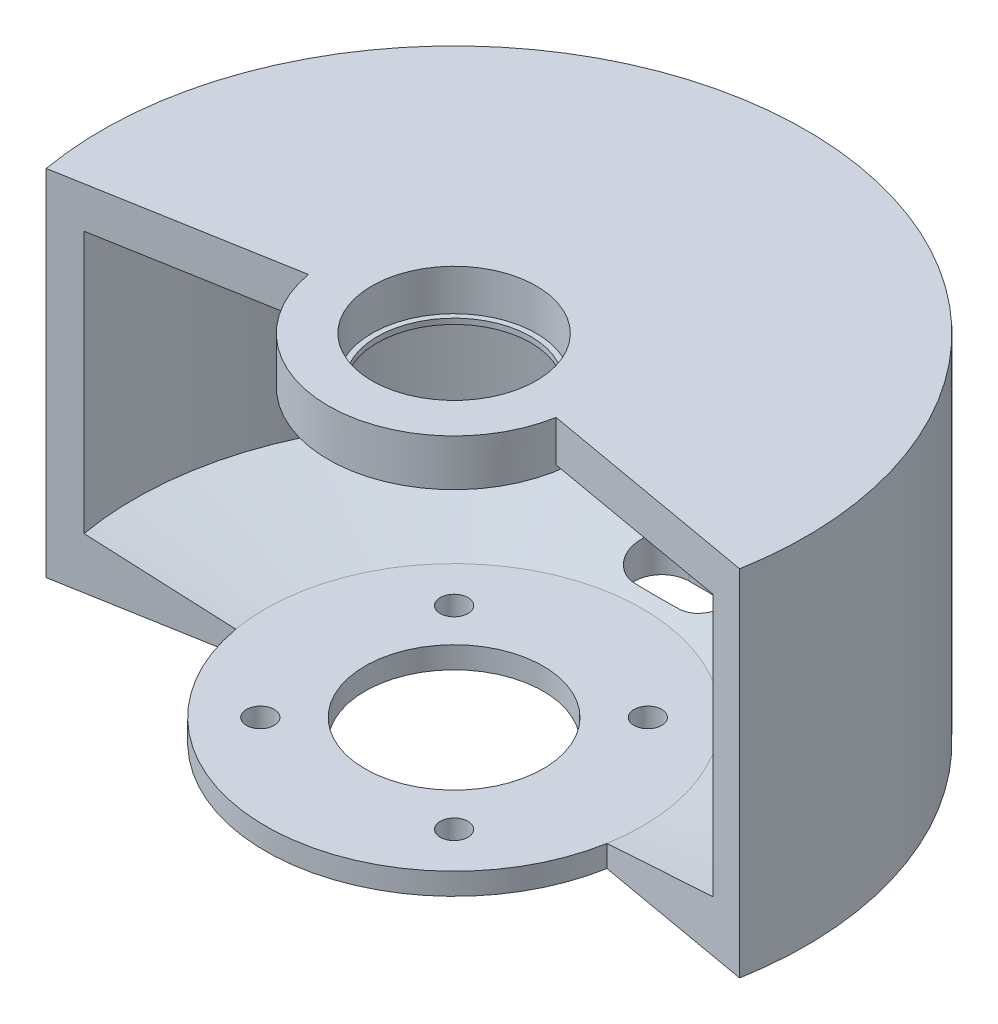
ISO-10303-21;
HEADER;
FILE_DESCRIPTION(('STEP AP214'),'2;1');
FILE_NAME('part.step','',(''),(''),'','','');
FILE_SCHEMA(('AUTOMOTIVE_DESIGN { 1 0 10303 214 1 1 1 1 }'));
ENDSEC;
DATA;
#1=APPLICATION_CONTEXT('core data for automotive mechanical design processes');
#2=APPLICATION_PROTOCOL_DEFINITION('international standard','automotive_design',2000,#1);
#3=PRODUCT_CONTEXT('',#1,'mechanical');
#4=PRODUCT('Part','Part','',(#3));
#5=PRODUCT_RELATED_PRODUCT_CATEGORY('part','',(#4));
#6=PRODUCT_DEFINITION_FORMATION('','',#4);
#7=PRODUCT_DEFINITION_CONTEXT('part definition',#1,'design');
#8=PRODUCT_DEFINITION('design','',#6,#7);
#9=PRODUCT_DEFINITION_SHAPE('','',#8);
#10=(LENGTH_UNIT() NAMED_UNIT(*) SI_UNIT(.MILLI.,.METRE.));
#11=(NAMED_UNIT(*) PLANE_ANGLE_UNIT() SI_UNIT($,.RADIAN.));
#12=(NAMED_UNIT(*) SI_UNIT($,.STERADIAN.) SOLID_ANGLE_UNIT());
#13=UNCERTAINTY_MEASURE_WITH_UNIT(LENGTH_MEASURE(1.E-05),#10,'distance_accuracy_value','');
#14=(GEOMETRIC_REPRESENTATION_CONTEXT(3) GLOBAL_UNCERTAINTY_ASSIGNED_CONTEXT((#13)) GLOBAL_UNIT_ASSIGNED_CONTEXT((#10,
#11,#12)) REPRESENTATION_CONTEXT('',''));
#15=CARTESIAN_POINT('',(0.,0.,0.));
#16=DIRECTION('',(0.,0.,1.));
#17=DIRECTION('',(1.,0.,0.));
#18=AXIS2_PLACEMENT_3D('',#15,#16,#17);
#19=CARTESIAN_POINT('',(0.,-17.3,0.));
#20=DIRECTION('',(0.,1.,0.));
#21=DIRECTION('',(0.,0.,1.));
#22=AXIS2_PLACEMENT_3D('',#19,#20,#21);
#23=CYLINDRICAL_SURFACE('',#22,27.5);
#24=CARTESIAN_POINT('',(0.,-14.125,0.));
#25=DIRECTION('',(0.,1.,0.));
#26=DIRECTION('',(0.,0.,1.));
#27=AXIS2_PLACEMENT_3D('',#24,#25,#26);
#28=CIRCLE('',#27,27.5);
#29=CARTESIAN_POINT('',(-27.0822132078357,-14.125,4.77532488584069));
#30=VERTEX_POINT('',#29);
#31=CARTESIAN_POINT('',(27.0822132078357,-14.125,4.77532488584069));
#32=VERTEX_POINT('',#31);
#33=EDGE_CURVE('E274',#30,#32,#28,.T.);
#34=ORIENTED_EDGE('',*,*,#33,.F.);
#35=DIRECTION('',(0.,-1.,0.));
#36=VECTOR('',#35,1.);
#37=CARTESIAN_POINT('',(-27.0822132078357,-17.3,4.77532488584068));
#38=LINE('',#37,#36);
#39=CARTESIAN_POINT('',(-27.0822132078357,-17.3,4.77532488584068));
#40=VERTEX_POINT('',#39);
#41=EDGE_CURVE('E277',#30,#40,#38,.T.);
#42=ORIENTED_EDGE('',*,*,#41,.T.);
#43=CARTESIAN_POINT('',(0.,-17.3,0.));
#44=DIRECTION('',(0.,1.,0.));
#45=DIRECTION('',(0.,0.,1.));
#46=AXIS2_PLACEMENT_3D('',#43,#44,#45);
#47=CIRCLE('',#46,27.5);
#48=CARTESIAN_POINT('',(27.0822132078357,-17.3,4.77532488584069));
#49=VERTEX_POINT('',#48);
#50=EDGE_CURVE('E11',#40,#49,#47,.T.);
#51=ORIENTED_EDGE('',*,*,#50,.T.);
#52=DIRECTION('',(0.,-1.,0.));
#53=VECTOR('',#52,1.);
#54=CARTESIAN_POINT('',(27.0822132078357,-17.3,4.77532488584069));
#55=LINE('',#54,#53);
#56=EDGE_CURVE('E279',#32,#49,#55,.T.);
#57=ORIENTED_EDGE('',*,*,#56,.F.);
#58=EDGE_LOOP('',(#34,#42,#51,#57));
#59=FACE_BOUND('',#58,.T.);
#60=ADVANCED_FACE('F37',(#59),#23,.T.);
#61=CARTESIAN_POINT('',(0.,-17.3,0.));
#62=DIRECTION('',(0.,1.,0.));
#63=DIRECTION('',(0.,0.,1.));
#64=AXIS2_PLACEMENT_3D('',#61,#62,#63);
#65=PLANE('',#64);
#66=CARTESIAN_POINT('',(3.25,-17.3,-33.5800000000001));
#67=DIRECTION('',(0.,-1.,0.));
#68=DIRECTION('',(0.,0.,-1.));
#69=AXIS2_PLACEMENT_3D('',#66,#67,#68);
#70=CIRCLE('',#69,3.96875);
#71=CARTESIAN_POINT('',(3.25,-17.3,-37.5487500000001));
#72=VERTEX_POINT('',#71);
#73=CARTESIAN_POINT('',(3.25,-17.3,-29.6112500000001));
#74=VERTEX_POINT('',#73);
#75=EDGE_CURVE('E140',#72,#74,#70,.T.);
#76=ORIENTED_EDGE('',*,*,#75,.F.);
#77=DIRECTION('',(1.,0.,0.));
#78=VECTOR('',#77,1.);
#79=CARTESIAN_POINT('',(-3.25,-17.3,-37.5487500000001));
#80=LINE('',#79,#78);
#81=CARTESIAN_POINT('',(-3.25,-17.3,-37.5487500000001));
#82=VERTEX_POINT('',#81);
#83=EDGE_CURVE('E415',#82,#72,#80,.T.);
#84=ORIENTED_EDGE('',*,*,#83,.F.);
#85=CARTESIAN_POINT('',(-3.25,-17.3,-33.5800000000001));
#86=DIRECTION('',(0.,-1.,0.));
#87=DIRECTION('',(0.,0.,-1.));
#88=AXIS2_PLACEMENT_3D('',#85,#86,#87);
#89=CIRCLE('',#88,3.96875000000001);
#90=CARTESIAN_POINT('',(-3.25,-17.3,-29.61125));
#91=VERTEX_POINT('',#90);
#92=EDGE_CURVE('E180',#91,#82,#89,.T.);
#93=ORIENTED_EDGE('',*,*,#92,.F.);
#94=DIRECTION('',(-1.,0.,0.));
#95=VECTOR('',#94,1.);
#96=CARTESIAN_POINT('',(-3.25,-17.3,-29.6112500000001));
#97=LINE('',#96,#95);
#98=EDGE_CURVE('E51',#74,#91,#97,.T.);
#99=ORIENTED_EDGE('',*,*,#98,.F.);
#100=EDGE_LOOP('',(#76,#84,#93,#99));
#101=FACE_BOUND('',#100,.T.);
#102=CARTESIAN_POINT('',(-14.1421356237311,-17.3,-14.1421356237308));
#103=DIRECTION('',(0.,1.,0.));
#104=DIRECTION('',(0.,0.,1.));
#105=AXIS2_PLACEMENT_3D('',#102,#103,#104);
#106=CIRCLE('',#105,2.025);
#107=CARTESIAN_POINT('',(-14.1421356237311,-17.3,-12.1171356237308));
#108=VERTEX_POINT('',#107);
#109=EDGE_CURVE('E328',#108,#108,#106,.T.);
#110=ORIENTED_EDGE('',*,*,#109,.T.);
#111=EDGE_LOOP('',(#110));
#112=FACE_BOUND('',#111,.T.);
#113=CARTESIAN_POINT('',(14.1421356237309,-17.3,-14.142135623731));
#114=DIRECTION('',(0.,1.,0.));
#115=DIRECTION('',(0.,0.,1.));
#116=AXIS2_PLACEMENT_3D('',#113,#114,#115);
#117=CIRCLE('',#116,2.025);
#118=CARTESIAN_POINT('',(14.1421356237309,-17.3,-12.117135623731));
#119=VERTEX_POINT('',#118);
#120=EDGE_CURVE('E334',#119,#119,#117,.T.);
#121=ORIENTED_EDGE('',*,*,#120,.T.);
#122=EDGE_LOOP('',(#121));
#123=FACE_BOUND('',#122,.T.);
#124=CARTESIAN_POINT('',(14.142135623731,-17.3,14.1421356237309));
#125=DIRECTION('',(0.,1.,0.));
#126=DIRECTION('',(0.,0.,1.));
#127=AXIS2_PLACEMENT_3D('',#124,#125,#126);
#128=CIRCLE('',#127,2.025);
#129=CARTESIAN_POINT('',(14.142135623731,-17.3,16.1671356237309));
#130=VERTEX_POINT('',#129);
#131=EDGE_CURVE('E340',#130,#130,#128,.T.);
#132=ORIENTED_EDGE('',*,*,#131,.T.);
#133=EDGE_LOOP('',(#132));
#134=FACE_BOUND('',#133,.T.);
#135=CARTESIAN_POINT('',(-14.142135623731,-17.3,14.142135623731));
#136=DIRECTION('',(0.,1.,0.));
#137=DIRECTION('',(0.,0.,1.));
#138=AXIS2_PLACEMENT_3D('',#135,#136,#137);
#139=CIRCLE('',#138,2.025);
#140=CARTESIAN_POINT('',(-14.142135623731,-17.3,16.167135623731));
#141=VERTEX_POINT('',#140);
#142=EDGE_CURVE('E346',#141,#141,#139,.T.);
#143=ORIENTED_EDGE('',*,*,#142,.T.);
#144=EDGE_LOOP('',(#143));
#145=FACE_BOUND('',#144,.T.);
#146=CARTESIAN_POINT('',(0.,-17.3,0.));
#147=DIRECTION('',(0.,1.,0.));
#148=DIRECTION('',(0.,0.,1.));
#149=AXIS2_PLACEMENT_3D('',#146,#147,#148);
#150=CIRCLE('',#149,13.000000035);
#151=CARTESIAN_POINT('',(0.,-17.3,13.000000035));
#152=VERTEX_POINT('',#151);
#153=EDGE_CURVE('E281',#152,#152,#150,.T.);
#154=ORIENTED_EDGE('',*,*,#153,.T.);
#155=EDGE_LOOP('',(#154));
#156=FACE_BOUND('',#155,.T.);
#157=ORIENTED_EDGE('',*,*,#50,.F.);
#158=DIRECTION('',(-0.984807753012207,0.,0.173648177666934));
#159=VECTOR('',#158,1.);
#160=CARTESIAN_POINT('',(-27.0822132078357,-17.3,4.77532488584068));
#161=LINE('',#160,#159);
#162=CARTESIAN_POINT('',(-50.6055773982236,-17.3,8.92312866963749));
#163=VERTEX_POINT('',#162);
#164=EDGE_CURVE('E294',#40,#163,#161,.T.);
#165=ORIENTED_EDGE('',*,*,#164,.T.);
#166=CARTESIAN_POINT('',(0.,-17.3,0.));
#167=DIRECTION('',(0.,-1.,0.));
#168=DIRECTION('',(0.,0.,-1.));
#169=AXIS2_PLACEMENT_3D('',#166,#167,#168);
#170=CIRCLE('',#169,51.38625);
#171=CARTESIAN_POINT('',(50.6055773982236,-17.3,8.92312866963749));
#172=VERTEX_POINT('',#171);
#173=EDGE_CURVE('E325',#163,#172,#170,.T.);
#174=ORIENTED_EDGE('',*,*,#173,.T.);
#175=DIRECTION('',(0.984807753012207,0.,0.173648177666934));
#176=VECTOR('',#175,1.);
#177=CARTESIAN_POINT('',(27.0822132078357,-17.3,4.77532488584069));
#178=LINE('',#177,#176);
#179=EDGE_CURVE('E362',#49,#172,#178,.T.);
#180=ORIENTED_EDGE('',*,*,#179,.F.);
#181=EDGE_LOOP('',(#157,#165,#174,#180));
#182=FACE_BOUND('',#181,.T.);
#183=ADVANCED_FACE('F255',(#101,#112,#123,#134,#145,#156,#182),#65,.F.);
#184=CARTESIAN_POINT('',(0.,-14.125,0.));
#185=DIRECTION('',(0.,1.,0.));
#186=DIRECTION('',(0.,0.,1.));
#187=AXIS2_PLACEMENT_3D('',#184,#185,#186);
#188=PLANE('',#187);
#189=CARTESIAN_POINT('',(-14.1421356237311,-14.125,-14.1421356237308));
#190=DIRECTION('',(0.,1.,0.));
#191=DIRECTION('',(0.,0.,1.));
#192=AXIS2_PLACEMENT_3D('',#189,#190,#191);
#193=CIRCLE('',#192,2.025);
#194=CARTESIAN_POINT('',(-14.1421356237311,-14.125,-12.1171356237308));
#195=VERTEX_POINT('',#194);
#196=EDGE_CURVE('E327',#195,#195,#193,.T.);
#197=ORIENTED_EDGE('',*,*,#196,.F.);
#198=EDGE_LOOP('',(#197));
#199=FACE_BOUND('',#198,.T.);
#200=CARTESIAN_POINT('',(14.1421356237309,-14.125,-14.142135623731));
#201=DIRECTION('',(0.,1.,0.));
#202=DIRECTION('',(0.,0.,1.));
#203=AXIS2_PLACEMENT_3D('',#200,#201,#202);
#204=CIRCLE('',#203,2.025);
#205=CARTESIAN_POINT('',(14.1421356237309,-14.125,-12.117135623731));
#206=VERTEX_POINT('',#205);
#207=EDGE_CURVE('E331',#206,#206,#204,.T.);
#208=ORIENTED_EDGE('',*,*,#207,.F.);
#209=EDGE_LOOP('',(#208));
#210=FACE_BOUND('',#209,.T.);
#211=CARTESIAN_POINT('',(14.142135623731,-14.125,14.1421356237309));
#212=DIRECTION('',(0.,1.,0.));
#213=DIRECTION('',(0.,0.,1.));
#214=AXIS2_PLACEMENT_3D('',#211,#212,#213);
#215=CIRCLE('',#214,2.025);
#216=CARTESIAN_POINT('',(14.142135623731,-14.125,16.1671356237309));
#217=VERTEX_POINT('',#216);
#218=EDGE_CURVE('E337',#217,#217,#215,.T.);
#219=ORIENTED_EDGE('',*,*,#218,.F.);
#220=EDGE_LOOP('',(#219));
#221=FACE_BOUND('',#220,.T.);
#222=CARTESIAN_POINT('',(-14.142135623731,-14.125,14.142135623731));
#223=DIRECTION('',(0.,1.,0.));
#224=DIRECTION('',(0.,0.,1.));
#225=AXIS2_PLACEMENT_3D('',#222,#223,#224);
#226=CIRCLE('',#225,2.025);
#227=CARTESIAN_POINT('',(-14.142135623731,-14.125,16.167135623731));
#228=VERTEX_POINT('',#227);
#229=EDGE_CURVE('E343',#228,#228,#226,.T.);
#230=ORIENTED_EDGE('',*,*,#229,.F.);
#231=EDGE_LOOP('',(#230));
#232=FACE_BOUND('',#231,.T.);
#233=CARTESIAN_POINT('',(0.,-14.125,0.));
#234=DIRECTION('',(0.,1.,0.));
#235=DIRECTION('',(0.,0.,1.));
#236=AXIS2_PLACEMENT_3D('',#233,#234,#235);
#237=CIRCLE('',#236,13.000000035);
#238=CARTESIAN_POINT('',(0.,-14.125,13.000000035));
#239=VERTEX_POINT('',#238);
#240=EDGE_CURVE('E349',#239,#239,#237,.T.);
#241=ORIENTED_EDGE('',*,*,#240,.F.);
#242=EDGE_LOOP('',(#241));
#243=FACE_BOUND('',#242,.T.);
#244=EDGE_CURVE('E40',#32,#30,#28,.T.);
#245=ORIENTED_EDGE('',*,*,#244,.T.);
#246=ORIENTED_EDGE('',*,*,#33,.T.);
#247=EDGE_LOOP('',(#245,#246));
#248=FACE_BOUND('',#247,.T.);
#249=ADVANCED_FACE('F253',(#199,#210,#221,#232,#243,#248),#188,.T.);
#250=CARTESIAN_POINT('',(0.,-17.3,0.));
#251=DIRECTION('',(0.,1.,0.));
#252=DIRECTION('',(0.,0.,1.));
#253=AXIS2_PLACEMENT_3D('',#250,#251,#252);
#254=CYLINDRICAL_SURFACE('',#253,13.000000035);
#255=ORIENTED_EDGE('',*,*,#153,.F.);
#256=EDGE_LOOP('',(#255));
#257=FACE_BOUND('',#256,.T.);
#258=ORIENTED_EDGE('',*,*,#240,.T.);
#259=EDGE_LOOP('',(#258));
#260=FACE_BOUND('',#259,.T.);
#261=ADVANCED_FACE('F249',(#257,#260),#254,.F.);
#262=CARTESIAN_POINT('',(-14.142135623731,-17.3,14.142135623731));
#263=DIRECTION('',(0.,1.,0.));
#264=DIRECTION('',(0.,0.,1.));
#265=AXIS2_PLACEMENT_3D('',#262,#263,#264);
#266=CYLINDRICAL_SURFACE('',#265,2.025);
#267=ORIENTED_EDGE('',*,*,#142,.F.);
#268=EDGE_LOOP('',(#267));
#269=FACE_BOUND('',#268,.T.);
#270=ORIENTED_EDGE('',*,*,#229,.T.);
#271=EDGE_LOOP('',(#270));
#272=FACE_BOUND('',#271,.T.);
#273=ADVANCED_FACE('F245',(#269,#272),#266,.F.);
#274=CARTESIAN_POINT('',(14.142135623731,-17.3,14.1421356237309));
#275=DIRECTION('',(0.,1.,0.));
#276=DIRECTION('',(0.,0.,1.));
#277=AXIS2_PLACEMENT_3D('',#274,#275,#276);
#278=CYLINDRICAL_SURFACE('',#277,2.025);
#279=ORIENTED_EDGE('',*,*,#131,.F.);
#280=EDGE_LOOP('',(#279));
#281=FACE_BOUND('',#280,.T.);
#282=ORIENTED_EDGE('',*,*,#218,.T.);
#283=EDGE_LOOP('',(#282));
#284=FACE_BOUND('',#283,.T.);
#285=ADVANCED_FACE('F241',(#281,#284),#278,.F.);
#286=CARTESIAN_POINT('',(14.1421356237309,-17.3,-14.142135623731));
#287=DIRECTION('',(0.,1.,0.));
#288=DIRECTION('',(0.,0.,1.));
#289=AXIS2_PLACEMENT_3D('',#286,#287,#288);
#290=CYLINDRICAL_SURFACE('',#289,2.025);
#291=ORIENTED_EDGE('',*,*,#120,.F.);
#292=EDGE_LOOP('',(#291));
#293=FACE_BOUND('',#292,.T.);
#294=ORIENTED_EDGE('',*,*,#207,.T.);
#295=EDGE_LOOP('',(#294));
#296=FACE_BOUND('',#295,.T.);
#297=ADVANCED_FACE('F237',(#293,#296),#290,.F.);
#298=CARTESIAN_POINT('',(-14.1421356237311,-17.3,-14.1421356237308));
#299=DIRECTION('',(0.,1.,0.));
#300=DIRECTION('',(0.,0.,1.));
#301=AXIS2_PLACEMENT_3D('',#298,#299,#300);
#302=CYLINDRICAL_SURFACE('',#301,2.025);
#303=ORIENTED_EDGE('',*,*,#109,.F.);
#304=EDGE_LOOP('',(#303));
#305=FACE_BOUND('',#304,.T.);
#306=ORIENTED_EDGE('',*,*,#196,.T.);
#307=EDGE_LOOP('',(#306));
#308=FACE_BOUND('',#307,.T.);
#309=ADVANCED_FACE('F233',(#305,#308),#302,.F.);
#310=CARTESIAN_POINT('',(0.,-14.125,0.));
#311=DIRECTION('',(0.,-1.,0.));
#312=DIRECTION('',(0.,0.,-1.));
#313=AXIS2_PLACEMENT_3D('',#310,#311,#312);
#314=CYLINDRICAL_SURFACE('',#313,51.38625);
#315=CARTESIAN_POINT('',(0.,34.42749997,0.));
#316=DIRECTION('',(0.,-1.,0.));
#317=DIRECTION('',(0.,0.,-1.));
#318=AXIS2_PLACEMENT_3D('',#315,#316,#317);
#319=CIRCLE('',#318,51.38625);
#320=CARTESIAN_POINT('',(-50.6055773982236,34.42749997,8.9231286696375));
#321=VERTEX_POINT('',#320);
#322=CARTESIAN_POINT('',(50.6055773982236,34.42749997,8.9231286696375));
#323=VERTEX_POINT('',#322);
#324=EDGE_CURVE('E323',#321,#323,#319,.T.);
#325=ORIENTED_EDGE('',*,*,#324,.T.);
#326=DIRECTION('',(0.,1.,0.));
#327=VECTOR('',#326,1.);
#328=CARTESIAN_POINT('',(50.6055773982236,-17.3,8.92312866963749));
#329=LINE('',#328,#327);
#330=EDGE_CURVE('E365',#172,#323,#329,.T.);
#331=ORIENTED_EDGE('',*,*,#330,.F.);
#332=ORIENTED_EDGE('',*,*,#173,.F.);
#333=DIRECTION('',(0.,1.,0.));
#334=VECTOR('',#333,1.);
#335=CARTESIAN_POINT('',(-50.6055773982236,-17.3,8.92312866963749));
#336=LINE('',#335,#334);
#337=EDGE_CURVE('E302',#163,#321,#336,.T.);
#338=ORIENTED_EDGE('',*,*,#337,.T.);
#339=EDGE_LOOP('',(#325,#331,#332,#338));
#340=FACE_BOUND('',#339,.T.);
#341=ADVANCED_FACE('F229',(#340),#314,.T.);
#342=CARTESIAN_POINT('',(-50.6055773982236,34.42749997,8.9231286696375));
#343=DIRECTION('',(0.,1.,0.));
#344=DIRECTION('',(0.,0.,1.));
#345=AXIS2_PLACEMENT_3D('',#342,#343,#344);
#346=PLANE('',#345);
#347=DIRECTION('',(0.984807753012208,0.,-0.173648177666934));
#348=VECTOR('',#347,1.);
#349=CARTESIAN_POINT('',(-50.6055773982236,34.42749997,8.9231286696375));
#350=LINE('',#349,#348);
#351=CARTESIAN_POINT('',(-18.071222267774,34.42749997,3.18644406018824));
#352=VERTEX_POINT('',#351);
#353=EDGE_CURVE('E305',#321,#352,#350,.T.);
#354=ORIENTED_EDGE('',*,*,#353,.T.);
#355=CARTESIAN_POINT('',(0.,34.42749997,0.));
#356=DIRECTION('',(0.,1.,0.));
#357=DIRECTION('',(0.,0.,1.));
#358=AXIS2_PLACEMENT_3D('',#355,#356,#357);
#359=CIRCLE('',#358,18.35);
#360=CARTESIAN_POINT('',(18.071222267774,34.42749997,3.18644406018824));
#361=VERTEX_POINT('',#360);
#362=EDGE_CURVE('E369',#352,#361,#359,.T.);
#363=ORIENTED_EDGE('',*,*,#362,.T.);
#364=DIRECTION('',(-0.984807753012207,0.,-0.173648177666934));
#365=VECTOR('',#364,1.);
#366=CARTESIAN_POINT('',(50.6055773982236,34.42749997,8.9231286696375));
#367=LINE('',#366,#365);
#368=EDGE_CURVE('E367',#323,#361,#367,.T.);
#369=ORIENTED_EDGE('',*,*,#368,.F.);
#370=ORIENTED_EDGE('',*,*,#324,.F.);
#371=EDGE_LOOP('',(#354,#363,#369,#370));
#372=FACE_BOUND('',#371,.T.);
#373=CARTESIAN_POINT('',(0.,34.42749997,0.));
#374=DIRECTION('',(0.,1.,0.));
#375=DIRECTION('',(0.,0.,1.));
#376=AXIS2_PLACEMENT_3D('',#373,#374,#375);
#377=CIRCLE('',#376,12.);
#378=CARTESIAN_POINT('',(0.,34.42749997,12.));
#379=VERTEX_POINT('',#378);
#380=EDGE_CURVE('E385',#379,#379,#377,.T.);
#381=ORIENTED_EDGE('',*,*,#380,.F.);
#382=EDGE_LOOP('',(#381));
#383=FACE_BOUND('',#382,.T.);
#384=ADVANCED_FACE('F225',(#372,#383),#346,.T.);
#385=CARTESIAN_POINT('',(-45.9154304745029,28.427500017,8.09612922349872));
#386=DIRECTION('',(0.,-1.,0.));
#387=DIRECTION('',(0.,0.,-1.));
#388=AXIS2_PLACEMENT_3D('',#385,#386,#387);
#389=PLANE('',#388);
#390=DIRECTION('',(0.984807753012207,0.,0.173648177666934));
#391=VECTOR('',#390,1.);
#392=CARTESIAN_POINT('',(45.9154304745029,28.427500017,8.09612922349872));
#393=LINE('',#392,#391);
#394=CARTESIAN_POINT('',(18.071222267774,28.427500017,3.18644406018824));
#395=VERTEX_POINT('',#394);
#396=CARTESIAN_POINT('',(45.9154304745029,28.427500017,8.09612922349872));
#397=VERTEX_POINT('',#396);
#398=EDGE_CURVE('E296',#395,#397,#393,.T.);
#399=ORIENTED_EDGE('',*,*,#398,.F.);
#400=CARTESIAN_POINT('',(0.,28.427500017,0.));
#401=DIRECTION('',(0.,-1.,0.));
#402=DIRECTION('',(0.,0.,-1.));
#403=AXIS2_PLACEMENT_3D('',#400,#401,#402);
#404=CIRCLE('',#403,18.35);
#405=CARTESIAN_POINT('',(-18.071222267774,28.427500017,3.18644406018824));
#406=VERTEX_POINT('',#405);
#407=EDGE_CURVE('E393',#406,#395,#404,.T.);
#408=ORIENTED_EDGE('',*,*,#407,.F.);
#409=DIRECTION('',(-0.984807753012208,0.,0.173648177666934));
#410=VECTOR('',#409,1.);
#411=CARTESIAN_POINT('',(-45.9154304745029,28.427500017,8.09612922349872));
#412=LINE('',#411,#410);
#413=CARTESIAN_POINT('',(-45.9154304745029,28.427500017,8.09612922349872));
#414=VERTEX_POINT('',#413);
#415=EDGE_CURVE('E311',#406,#414,#412,.T.);
#416=ORIENTED_EDGE('',*,*,#415,.T.);
#417=CARTESIAN_POINT('',(0.,28.427500017,0.));
#418=DIRECTION('',(0.,-1.,0.));
#419=DIRECTION('',(0.,0.,-1.));
#420=AXIS2_PLACEMENT_3D('',#417,#418,#419);
#421=CIRCLE('',#420,46.62375);
#422=EDGE_CURVE('E321',#414,#397,#421,.T.);
#423=ORIENTED_EDGE('',*,*,#422,.T.);
#424=EDGE_LOOP('',(#399,#408,#416,#423));
#425=FACE_BOUND('',#424,.T.);
#426=ADVANCED_FACE('F221',(#425),#389,.T.);
#427=CARTESIAN_POINT('',(0.,-14.125,0.));
#428=DIRECTION('',(0.,-1.,0.));
#429=DIRECTION('',(0.,0.,-1.));
#430=AXIS2_PLACEMENT_3D('',#427,#428,#429);
#431=CYLINDRICAL_SURFACE('',#430,46.62375);
#432=CARTESIAN_POINT('',(0.,-9.79529118930715,0.));
#433=DIRECTION('',(0.,-1.,0.));
#434=DIRECTION('',(0.,0.,-1.));
#435=AXIS2_PLACEMENT_3D('',#432,#433,#434);
#436=CIRCLE('',#435,46.62375);
#437=CARTESIAN_POINT('',(-45.9154304745029,-9.79529118930715,8.09612922349872));
#438=VERTEX_POINT('',#437);
#439=CARTESIAN_POINT('',(45.9154304745029,-9.79529118930715,8.09612922349872));
#440=VERTEX_POINT('',#439);
#441=EDGE_CURVE('E318',#438,#440,#436,.T.);
#442=ORIENTED_EDGE('',*,*,#441,.T.);
#443=DIRECTION('',(0.,-1.,0.));
#444=VECTOR('',#443,1.);
#445=CARTESIAN_POINT('',(45.9154304745029,-9.79529118930715,8.09612922349872));
#446=LINE('',#445,#444);
#447=EDGE_CURVE('E292',#397,#440,#446,.T.);
#448=ORIENTED_EDGE('',*,*,#447,.F.);
#449=ORIENTED_EDGE('',*,*,#422,.F.);
#450=DIRECTION('',(0.,-1.,0.));
#451=VECTOR('',#450,1.);
#452=CARTESIAN_POINT('',(-45.9154304745029,-9.79529118930715,8.09612922349872));
#453=LINE('',#452,#451);
#454=EDGE_CURVE('E314',#414,#438,#453,.T.);
#455=ORIENTED_EDGE('',*,*,#454,.T.);
#456=EDGE_LOOP('',(#442,#448,#449,#455));
#457=FACE_BOUND('',#456,.T.);
#458=ADVANCED_FACE('F218',(#457),#431,.F.);
#459=CARTESIAN_POINT('',(0.,-9.79529118930715,0.));
#460=DIRECTION('',(0.,1.,0.));
#461=DIRECTION('',(0.,0.,1.));
#462=AXIS2_PLACEMENT_3D('',#459,#460,#461);
#463=CONICAL_SURFACE('',#462,46.62375,1.34814517769668);
#464=CARTESIAN_POINT('',(-11.0602178223479,-11.4887878767654,-37.5487500000001));
#465=CARTESIAN_POINT('',(-10.1392970610014,-11.5477324427178,-37.5487500000001));
#466=CARTESIAN_POINT('',(-9.21792970021718,-11.5998738913841,-37.5487500000001));
#467=CARTESIAN_POINT('',(-7.37447826630107,-11.6898995303997,-37.5487500000001));
#468=CARTESIAN_POINT('',(-6.45239417654559,-11.7277833795363,-37.5487500000001));
#469=CARTESIAN_POINT('',(-4.60871356440104,-11.7886074594138,-37.5487500000001));
#470=CARTESIAN_POINT('',(-3.68711757086974,-11.8115635849304,-37.5487500000001));
#471=CARTESIAN_POINT('',(-1.84368104967349,-11.8422171491438,-37.5487500000001));
#472=CARTESIAN_POINT('',(-0.921840524836743,-11.8499147572286,-37.5487500000001));
#473=CARTESIAN_POINT('',(0.921840524836747,-11.8499147572286,-37.5487500000001));
#474=CARTESIAN_POINT('',(1.84368104967349,-11.8422171491438,-37.5487500000001));
#475=CARTESIAN_POINT('',(3.68711757086974,-11.8115635849304,-37.5487500000001));
#476=CARTESIAN_POINT('',(4.60871356440104,-11.7886074594138,-37.5487500000001));
#477=CARTESIAN_POINT('',(6.45239417654559,-11.7277833795363,-37.5487500000001));
#478=CARTESIAN_POINT('',(7.37447826630107,-11.6898995303997,-37.54875));
#479=CARTESIAN_POINT('',(9.21792970021719,-11.5998738913841,-37.54875));
#480=CARTESIAN_POINT('',(10.1392970610014,-11.5477324427178,-37.54875));
#481=CARTESIAN_POINT('',(11.0602178223479,-11.4887878767654,-37.54875));
#482=B_SPLINE_CURVE_WITH_KNOTS('',3,(#464,#465,#466,#467,#468,#469,#470,#471,#472,#473,#474,
#475,#476,#477,#478,#479,#480,#481),.UNSPECIFIED.,.F.,.F.,(4,2,2,2,2,2,2,2,4),(0.,
2.76840716200577,5.53688057328277,8.30240131517787,11.0678913562956,13.8333813974134,
16.5989021393085,19.3673755505855,22.1357827125912),.UNSPECIFIED.);
#483=CARTESIAN_POINT('',(-3.24999999999999,-11.8181302298932,-37.5487500000001));
#484=VERTEX_POINT('',#483);
#485=CARTESIAN_POINT('',(3.25,-11.8181302298932,-37.5487500000001));
#486=VERTEX_POINT('',#485);
#487=EDGE_CURVE('E146',#484,#486,#482,.T.);
#488=ORIENTED_EDGE('',*,*,#487,.T.);
#489=CARTESIAN_POINT('',(3.2498,-11.8181341355666,-37.5487499949607));
#490=CARTESIAN_POINT('',(3.35949944009595,-11.8159893595111,-37.5487684623182));
#491=CARTESIAN_POINT('',(3.469215240618,-11.8147664092114,-37.5442132784508));
#492=CARTESIAN_POINT('',(3.68789172669671,-11.8141628407238,-37.5260406167942));
#493=CARTESIAN_POINT('',(3.79685246232451,-11.8147820991774,-37.5124237458433));
#494=CARTESIAN_POINT('',(4.01312558433636,-11.8178596301022,-37.4762328290187));
#495=CARTESIAN_POINT('',(4.12043966874046,-11.8203158570983,-37.4536687590218));
#496=CARTESIAN_POINT('',(4.33277732571412,-11.8270491482985,-37.3997602308743));
#497=CARTESIAN_POINT('',(4.43780092113617,-11.8313261943272,-37.368415860369));
#498=CARTESIAN_POINT('',(4.64484349712072,-11.8416776123543,-37.2971723282464));
#499=CARTESIAN_POINT('',(4.74686191525048,-11.8477523184725,-37.2572715766879));
#500=CARTESIAN_POINT('',(4.94716812515003,-11.861660682416,-37.169232284623));
#501=CARTESIAN_POINT('',(5.04545452526158,-11.8694949890049,-37.1210907072902));
#502=CARTESIAN_POINT('',(5.33357369438793,-11.8955673736331,-36.964863777569));
#503=CARTESIAN_POINT('',(5.51691161903003,-11.9163871915241,-36.8448914696358));
#504=CARTESIAN_POINT('',(5.86181873359314,-11.9645340372116,-36.57625051247));
#505=CARTESIAN_POINT('',(6.02325266276401,-11.9918988487487,-36.4274162259353));
#506=CARTESIAN_POINT('',(6.31901052456939,-12.0524413641425,-36.105838569133));
#507=CARTESIAN_POINT('',(6.45332863853117,-12.085620312784,-35.9330900805917));
#508=CARTESIAN_POINT('',(6.69349162278336,-12.1576331939395,-35.5655388289472));
#509=CARTESIAN_POINT('',(6.79880944423466,-12.1965542451377,-35.3704090214059));
#510=CARTESIAN_POINT('',(6.97534741753542,-12.2786925370296,-34.9661533030572));
#511=CARTESIAN_POINT('',(7.04656618025985,-12.3219099526617,-34.7570268224498));
#512=CARTESIAN_POINT('',(7.15445130584522,-12.4125681459888,-34.3260584425347));
#513=CARTESIAN_POINT('',(7.19036146171349,-12.4600785040128,-34.1040418281904));
#514=CARTESIAN_POINT('',(7.22430334901643,-12.5573415419572,-33.6576118832592));
#515=CARTESIAN_POINT('',(7.22233016124841,-12.607094512247,-33.433198245197));
#516=CARTESIAN_POINT('',(7.18036036935757,-12.708446836118,-32.9842366164996));
#517=CARTESIAN_POINT('',(7.13970557519907,-12.7600632447416,-32.7597536625796));
#518=CARTESIAN_POINT('',(7.0206142583109,-12.8628681426134,-32.3209661006375));
#519=CARTESIAN_POINT('',(6.94217555737258,-12.9140566070179,-32.1066620802046));
#520=CARTESIAN_POINT('',(6.74890264797668,-13.0148225883891,-31.6929359634299));
#521=CARTESIAN_POINT('',(6.63385588947643,-13.0643887847238,-31.4936093989226));
#522=CARTESIAN_POINT('',(6.43659153750598,-13.136009444353,-31.2114882466266));
#523=CARTESIAN_POINT('',(6.36667815858433,-13.1594397257032,-31.1202161407801));
#524=CARTESIAN_POINT('',(6.21905731744097,-13.2051981132731,-30.943929663483));
#525=CARTESIAN_POINT('',(6.14135298250284,-13.227526656402,-30.8589128047522));
#526=CARTESIAN_POINT('',(5.97952754536589,-13.2706475738298,-30.6966595107386));
#527=CARTESIAN_POINT('',(5.89548282071698,-13.2914536737128,-30.6193504308242));
#528=CARTESIAN_POINT('',(5.72086747259332,-13.3315820912041,-30.4721352591941));
#529=CARTESIAN_POINT('',(5.63029951106509,-13.3509050074821,-30.4022261761914));
#530=CARTESIAN_POINT('',(5.44317476569915,-13.3878936730877,-30.2703059590788));
#531=CARTESIAN_POINT('',(5.34661420590224,-13.405558359581,-30.208299881377));
#532=CARTESIAN_POINT('',(5.14828204389405,-13.4390233243842,-30.0927854664017));
#533=CARTESIAN_POINT('',(5.04651263909262,-13.4548243797422,-30.0392735841995));
#534=CARTESIAN_POINT('',(4.84102721998819,-13.4840320115137,-29.9423917974122));
#535=CARTESIAN_POINT('',(4.73742039348204,-13.4974878634669,-29.8988050920885));
#536=CARTESIAN_POINT('',(4.52670387459739,-13.5223138771331,-29.8205280504339));
#537=CARTESIAN_POINT('',(4.41959568966016,-13.5336849228393,-29.7858339409963));
#538=CARTESIAN_POINT('',(4.2027695348438,-13.5542041805416,-29.7256712971099));
#539=CARTESIAN_POINT('',(4.09305526400737,-13.563355357987,-29.700190432403));
#540=CARTESIAN_POINT('',(3.87174086226678,-13.5793429835748,-29.6586379525817));
#541=CARTESIAN_POINT('',(3.76014179066559,-13.5861806892869,-29.6425612220407));
#542=CARTESIAN_POINT('',(3.58185567108251,-13.5951514498479,-29.6245891987202));
#543=CARTESIAN_POINT('',(3.5155058897683,-13.5980641597234,-29.6195821999347));
#544=CARTESIAN_POINT('',(3.38271022816015,-13.6030418820062,-29.612913137062));
#545=CARTESIAN_POINT('',(3.31626465709132,-13.6051082037528,-29.6112458908034));
#546=CARTESIAN_POINT('',(3.2498,-13.6067487479911,-29.6112500050394));
#547=B_SPLINE_CURVE_WITH_KNOTS('',3,(#489,#490,#491,#492,#493,#494,#495,#496,#497,#498,#499,
#500,#501,#502,#503,#504,#505,#506,#507,#508,#509,#510,#511,#512,#513,#514,#515,#516,#517,#518,
#519,#520,#521,#522,#523,#524,#525,#526,#527,#528,#529,#530,#531,#532,#533,#534,#535,#536,#537,
#538,#539,#540,#541,#542,#543,#544,#545,#546),.UNSPECIFIED.,.F.,.F.,(4,2,2,2,2,2,2,2,2,2,2,2,2,
2,2,2,2,2,2,2,2,2,2,2,2,2,2,2,4),(0.,0.329059753125211,0.658097472163736,0.986769350302325,
1.31543794773939,1.64416767116133,1.97301879657723,2.62995165162315,3.29077257516352,
3.95173515120636,4.62401778364125,5.29632780114849,5.98274198674314,6.66924530473773,
7.36764277403224,8.06608051013961,8.76864980021387,9.12030124055754,9.47181208912694,
9.81961310345606,10.167272985575,10.515154198537,10.8628898444602,11.2020854827362,
11.5411369619892,11.8797329879263,12.2181446611503,12.4178700858182,12.6172853630713),.UNSPECIFIED.);
#548=CARTESIAN_POINT('',(3.25,-13.6067438091036,-29.6112500000001));
#549=VERTEX_POINT('',#548);
#550=EDGE_CURVE('E134',#486,#549,#547,.T.);
#551=ORIENTED_EDGE('',*,*,#550,.T.);
#552=CARTESIAN_POINT('',(11.0602178223479,-13.1946107630083,-29.6112500000001));
#553=CARTESIAN_POINT('',(10.5999434221096,-13.2310748047947,-29.6112500000001));
#554=CARTESIAN_POINT('',(10.1395130066493,-13.2655509369763,-29.6112500000001));
#555=CARTESIAN_POINT('',(9.2183559358443,-13.3303465613479,-29.6112500000001));
#556=CARTESIAN_POINT('',(8.75762927789557,-13.3606660164848,-29.6112500000001));
#557=CARTESIAN_POINT('',(7.37500010981489,-13.4451196999124,-29.6112500000001));
#558=CARTESIAN_POINT('',(6.45268918650632,-13.4927459836149,-29.6112500000001));
#559=CARTESIAN_POINT('',(4.60884017695772,-13.5693814446218,-29.6112500000001));
#560=CARTESIAN_POINT('',(3.68730338269889,-13.5984216625931,-29.6112500000001));
#561=CARTESIAN_POINT('',(1.8438443847619,-13.6372321073751,-29.6112500000001));
#562=CARTESIAN_POINT('',(0.921922192380951,-13.6470028641571,-29.6112500000001));
#563=CARTESIAN_POINT('',(-0.921922192380941,-13.6470028641571,-29.6112500000001));
#564=CARTESIAN_POINT('',(-1.84384438476189,-13.6372321073751,-29.6112500000001));
#565=CARTESIAN_POINT('',(-3.68730338269888,-13.5984216625931,-29.6112500000001));
#566=CARTESIAN_POINT('',(-4.60884017695771,-13.5693814446218,-29.6112500000001));
#567=CARTESIAN_POINT('',(-6.45268918650631,-13.4927459836149,-29.6112500000001));
#568=CARTESIAN_POINT('',(-7.37500010981488,-13.4451196999124,-29.6112500000001));
#569=CARTESIAN_POINT('',(-8.75762927789556,-13.3606660164848,-29.6112500000001));
#570=CARTESIAN_POINT('',(-9.21835593584429,-13.3303465613479,-29.6112500000001));
#571=CARTESIAN_POINT('',(-10.1395130066493,-13.2655509369763,-29.6112500000001));
#572=CARTESIAN_POINT('',(-10.5999434221095,-13.2310748047947,-29.6112500000001));
#573=CARTESIAN_POINT('',(-11.0602178223479,-13.1946107630083,-29.6112500000001));
#574=B_SPLINE_CURVE_WITH_KNOTS('',3,(#552,#553,#554,#555,#556,#557,#558,#559,#560,#561,#562,
#563,#564,#565,#566,#567,#568,#569,#570,#571,#572,#573),.UNSPECIFIED.,.F.,.F.,(4,2,2,2,2,2,2,2,
2,2,4),(0.,1.38514141332787,2.77029517313217,5.54072540790977,8.30651657768233,11.0722316783644,
13.8379467790465,16.603737948819,19.3741681835966,20.7593219434009,22.1444633567288),.UNSPECIFIED.);
#575=CARTESIAN_POINT('',(-3.25,-13.6067438091036,-29.6112500000001));
#576=VERTEX_POINT('',#575);
#577=EDGE_CURVE('E124',#549,#576,#574,.T.);
#578=ORIENTED_EDGE('',*,*,#577,.T.);
#579=CARTESIAN_POINT('',(-3.24979999999999,-13.6067487479911,-29.6112500050394));
#580=CARTESIAN_POINT('',(-3.35957656210272,-13.6040429122123,-29.6112319772891));
#581=CARTESIAN_POINT('',(-3.46931662107815,-13.6001685869843,-29.6157934237212));
#582=CARTESIAN_POINT('',(-3.68792486634178,-13.590147985314,-29.6339638565506));
#583=CARTESIAN_POINT('',(-3.79679318000545,-13.5840020472151,-29.6475714958117));
#584=CARTESIAN_POINT('',(-4.01270234390774,-13.56951514375,-29.6836912013003));
#585=CARTESIAN_POINT('',(-4.11974606938935,-13.5611780547429,-29.7061875775206));
#586=CARTESIAN_POINT('',(-4.33141612894453,-13.5424039558474,-29.7598620505213));
#587=CARTESIAN_POINT('',(-4.43604243725735,-13.5319669235928,-29.7910402397718));
#588=CARTESIAN_POINT('',(-4.74519612964418,-13.497665198292,-29.8972389457313));
#589=CARTESIAN_POINT('',(-4.94519797521031,-13.470796289426,-29.9849573653162));
#590=CARTESIAN_POINT('',(-5.32726898159946,-13.4101865903155,-30.1913187473168));
#591=CARTESIAN_POINT('',(-5.50933564965213,-13.3764448468246,-30.3099660001296));
#592=CARTESIAN_POINT('',(-5.8540793317547,-13.3026993618606,-30.5769873467657));
#593=CARTESIAN_POINT('',(-6.01635835048354,-13.2625957941165,-30.7258482179332));
#594=CARTESIAN_POINT('',(-6.31365639141043,-13.1779818593651,-31.0476098140951));
#595=CARTESIAN_POINT('',(-6.44866918880284,-13.1334704895171,-31.2205160133941));
#596=CARTESIAN_POINT('',(-6.69156328075404,-13.0401588565425,-31.5907765131002));
#597=CARTESIAN_POINT('',(-6.79856815473252,-12.9912728426076,-31.7886844134804));
#598=CARTESIAN_POINT('',(-6.97759443468905,-12.8918479291023,-32.1993502300694));
#599=CARTESIAN_POINT('',(-7.04961369193535,-12.8413089282129,-32.4121090574686));
#600=CARTESIAN_POINT('',(-7.15781487493819,-12.7390793094567,-32.850664259805));
#601=CARTESIAN_POINT('',(-7.19330969061375,-12.687384673786,-33.0766289416309));
#602=CARTESIAN_POINT('',(-7.22499644713137,-12.5851673562712,-33.5317061688584));
#603=CARTESIAN_POINT('',(-7.22118608015501,-12.5346447434174,-33.7608188983101));
#604=CARTESIAN_POINT('',(-7.18596149463953,-12.4607554782877,-34.1018727807898));
#605=CARTESIAN_POINT('',(-7.16925160977897,-12.4364042927289,-34.2152998140985));
#606=CARTESIAN_POINT('',(-7.12604763946859,-12.388497374624,-34.4404327427386));
#607=CARTESIAN_POINT('',(-7.09955729671946,-12.3649413415544,-34.5521392794429));
#608=CARTESIAN_POINT('',(-7.0369253852598,-12.3187681364424,-34.7730485886671));
#609=CARTESIAN_POINT('',(-7.00078043101867,-12.2961512969627,-34.8822504682781));
#610=CARTESIAN_POINT('',(-6.91907722122702,-12.2520170686446,-35.0972563457848));
#611=CARTESIAN_POINT('',(-6.87352271890016,-12.2304992456923,-35.2030616790918));
#612=CARTESIAN_POINT('',(-6.77389618188186,-12.1889499271868,-35.4092290524493));
#613=CARTESIAN_POINT('',(-6.71993586462487,-12.168903399297,-35.5096420553507));
#614=CARTESIAN_POINT('',(-6.60347238744143,-12.13014263453,-35.7056022132693));
#615=CARTESIAN_POINT('',(-6.54097265694698,-12.1114278673826,-35.8011513006002));
#616=CARTESIAN_POINT('',(-6.4078105826743,-12.0754353591711,-35.9867100823049));
#617=CARTESIAN_POINT('',(-6.33714609413847,-12.0581579977511,-36.0767183116188));
#618=CARTESIAN_POINT('',(-6.18818054745394,-12.0251622219539,-36.2504225916917));
#619=CARTESIAN_POINT('',(-6.10988259290928,-12.0094431791973,-36.3341211834727));
#620=CARTESIAN_POINT('',(-5.94784501119601,-11.9799602211189,-36.4929393906684));
#621=CARTESIAN_POINT('',(-5.86424855235575,-11.9661630277483,-36.5681989299866));
#622=CARTESIAN_POINT('',(-5.69084645151059,-11.9402444479673,-36.7114351076264));
#623=CARTESIAN_POINT('',(-5.60104333317022,-11.9281223863824,-36.7794146776941));
#624=CARTESIAN_POINT('',(-5.41577596441375,-11.9056162711193,-36.9076252094244));
#625=CARTESIAN_POINT('',(-5.32030820597799,-11.8952333099768,-36.9678512947465));
#626=CARTESIAN_POINT('',(-5.12449042750027,-11.8762838039064,-37.0799981514658));
#627=CARTESIAN_POINT('',(-5.02414236173062,-11.8677165391448,-37.1319222121923));
#628=CARTESIAN_POINT('',(-4.82120469414701,-11.8525920191948,-37.2261722478916));
#629=CARTESIAN_POINT('',(-4.71869328483785,-11.8459998401284,-37.2686610562938));
#630=CARTESIAN_POINT('',(-4.51042260780161,-11.8346539671835,-37.3449174599137));
#631=CARTESIAN_POINT('',(-4.40466466353503,-11.8298995346084,-37.3786885574668));
#632=CARTESIAN_POINT('',(-4.19076060345844,-11.8222593809997,-37.4372306697912));
#633=CARTESIAN_POINT('',(-4.08261751582362,-11.8193714172751,-37.4620124700475));
#634=CARTESIAN_POINT('',(-3.864647430168,-11.8154740731406,-37.5024305230926));
#635=CARTESIAN_POINT('',(-3.75482132512689,-11.8144637290733,-37.5180714644487));
#636=CARTESIAN_POINT('',(-3.57891801107457,-11.8143526422133,-37.5356470787508));
#637=CARTESIAN_POINT('',(-3.51312494219042,-11.8146445172615,-37.5405670134444));
#638=CARTESIAN_POINT('',(-3.38148817346997,-11.8158926813165,-37.5471178155871));
#639=CARTESIAN_POINT('',(-3.31564472732717,-11.816847895721,-37.5487539860438));
#640=CARTESIAN_POINT('',(-3.2498,-11.8181341355666,-37.5487499949607));
#641=B_SPLINE_CURVE_WITH_KNOTS('',3,(#579,#580,#581,#582,#583,#584,#585,#586,#587,#588,#589,
#590,#591,#592,#593,#594,#595,#596,#597,#598,#599,#600,#601,#602,#603,#604,#605,#606,#607,#608,
#609,#610,#611,#612,#613,#614,#615,#616,#617,#618,#619,#620,#621,#622,#623,#624,#625,#626,#627,
#628,#629,#630,#631,#632,#633,#634,#635,#636,#637,#638,#639,#640),.UNSPECIFIED.,.F.,.F.,(4,2,2,
2,2,2,2,2,2,2,2,2,2,2,2,2,2,2,2,2,2,2,2,2,2,2,2,2,2,2,4),(0.,0.329315257246878,
0.658581484678213,0.987269083887605,1.31596018408318,1.97274108756856,2.62961314715314,
3.29805482236057,3.96664892893847,4.65417325913524,5.34173981007247,6.04201689257524,
6.74233509234149,7.09361315922276,7.44475694115436,7.79602401880501,8.1471512547991,
8.49395744562186,8.84062476608229,9.18738335869405,9.53400155001405,9.87356584639294,
10.2129928770938,10.552632348905,10.892136917543,11.2252258546102,11.5581807643863,
11.8907348584026,12.2231182273381,12.4209730210977,12.6185080377899),.UNSPECIFIED.);
#642=EDGE_CURVE('E133',#576,#484,#641,.T.);
#643=ORIENTED_EDGE('',*,*,#642,.T.);
#644=EDGE_LOOP('',(#488,#551,#578,#643));
#645=FACE_BOUND('',#644,.T.);
#646=DIRECTION('',(0.960498227772846,-0.220816102769832,-0.169361752479021));
#647=VECTOR('',#646,1.);
#648=CARTESIAN_POINT('',(-27.0822132078357,-14.125,4.77532488584068));
#649=LINE('',#648,#647);
#650=EDGE_CURVE('E286',#438,#30,#649,.T.);
#651=ORIENTED_EDGE('',*,*,#650,.T.);
#652=ORIENTED_EDGE('',*,*,#244,.F.);
#653=DIRECTION('',(-0.960498227772846,-0.220816102769832,-0.169361752479021));
#654=VECTOR('',#653,1.);
#655=CARTESIAN_POINT('',(27.0822132078357,-14.125,4.77532488584069));
#656=LINE('',#655,#654);
#657=EDGE_CURVE('E284',#440,#32,#656,.T.);
#658=ORIENTED_EDGE('',*,*,#657,.F.);
#659=ORIENTED_EDGE('',*,*,#441,.F.);
#660=EDGE_LOOP('',(#651,#652,#658,#659));
#661=FACE_BOUND('',#660,.T.);
#662=ADVANCED_FACE('F144',(#645,#661),#463,.F.);
#663=CARTESIAN_POINT('',(0.,0.,0.));
#664=DIRECTION('',(-0.173648177666934,0.,-0.984807753012208));
#665=DIRECTION('',(-0.984807753012208,0.,0.173648177666934));
#666=AXIS2_PLACEMENT_3D('',#663,#664,#665);
#667=PLANE('',#666);
#668=ORIENTED_EDGE('',*,*,#41,.F.);
#669=ORIENTED_EDGE('',*,*,#650,.F.);
#670=ORIENTED_EDGE('',*,*,#454,.F.);
#671=ORIENTED_EDGE('',*,*,#415,.F.);
#672=DIRECTION('',(0.,-1.,0.));
#673=VECTOR('',#672,1.);
#674=CARTESIAN_POINT('',(-18.071222267774,34.42749997,3.18644406018824));
#675=LINE('',#674,#673);
#676=EDGE_CURVE('E308',#352,#406,#675,.T.);
#677=ORIENTED_EDGE('',*,*,#676,.F.);
#678=ORIENTED_EDGE('',*,*,#353,.F.);
#679=ORIENTED_EDGE('',*,*,#337,.F.);
#680=ORIENTED_EDGE('',*,*,#164,.F.);
#681=EDGE_LOOP('',(#668,#669,#670,#671,#677,#678,#679,#680));
#682=FACE_BOUND('',#681,.T.);
#683=ADVANCED_FACE('F211',(#682),#667,.F.);
#684=CARTESIAN_POINT('',(0.,0.,0.));
#685=DIRECTION('',(-0.173648177666934,0.,0.984807753012207));
#686=DIRECTION('',(0.984807753012207,0.,0.173648177666934));
#687=AXIS2_PLACEMENT_3D('',#684,#685,#686);
#688=PLANE('',#687);
#689=ORIENTED_EDGE('',*,*,#56,.T.);
#690=ORIENTED_EDGE('',*,*,#179,.T.);
#691=ORIENTED_EDGE('',*,*,#330,.T.);
#692=ORIENTED_EDGE('',*,*,#368,.T.);
#693=DIRECTION('',(0.,-1.,0.));
#694=VECTOR('',#693,1.);
#695=CARTESIAN_POINT('',(18.071222267774,34.42749997,3.18644406018824));
#696=LINE('',#695,#694);
#697=EDGE_CURVE('E375',#361,#395,#696,.T.);
#698=ORIENTED_EDGE('',*,*,#697,.T.);
#699=ORIENTED_EDGE('',*,*,#398,.T.);
#700=ORIENTED_EDGE('',*,*,#447,.T.);
#701=ORIENTED_EDGE('',*,*,#657,.T.);
#702=EDGE_LOOP('',(#689,#690,#691,#692,#698,#699,#700,#701));
#703=FACE_BOUND('',#702,.T.);
#704=ADVANCED_FACE('F207',(#703),#688,.T.);
#705=CARTESIAN_POINT('',(0.,34.42749997,0.));
#706=DIRECTION('',(0.,-1.,0.));
#707=DIRECTION('',(0.,0.,-1.));
#708=AXIS2_PLACEMENT_3D('',#705,#706,#707);
#709=CYLINDRICAL_SURFACE('',#708,18.35);
#710=ORIENTED_EDGE('',*,*,#362,.F.);
#711=ORIENTED_EDGE('',*,*,#676,.T.);
#712=ORIENTED_EDGE('',*,*,#407,.T.);
#713=ORIENTED_EDGE('',*,*,#697,.F.);
#714=EDGE_LOOP('',(#710,#711,#712,#713));
#715=FACE_BOUND('',#714,.T.);
#716=CARTESIAN_POINT('',(0.,27.633750017,0.));
#717=DIRECTION('',(0.,-1.,0.));
#718=DIRECTION('',(0.,0.,-1.));
#719=AXIS2_PLACEMENT_3D('',#716,#717,#718);
#720=CIRCLE('',#719,18.35);
#721=CARTESIAN_POINT('',(0.,27.633750017,-18.35));
#722=VERTEX_POINT('',#721);
#723=EDGE_CURVE('E391',#722,#722,#720,.T.);
#724=ORIENTED_EDGE('',*,*,#723,.F.);
#725=EDGE_LOOP('',(#724));
#726=FACE_BOUND('',#725,.T.);
#727=ADVANCED_FACE('F203',(#715,#726),#709,.T.);
#728=CARTESIAN_POINT('',(0.,34.42749997,0.));
#729=DIRECTION('',(0.,-1.,0.));
#730=DIRECTION('',(0.,0.,-1.));
#731=AXIS2_PLACEMENT_3D('',#728,#729,#730);
#732=CYLINDRICAL_SURFACE('',#731,12.);
#733=ORIENTED_EDGE('',*,*,#380,.T.);
#734=EDGE_LOOP('',(#733));
#735=FACE_BOUND('',#734,.T.);
#736=CARTESIAN_POINT('',(0.,28.42749997,0.));
#737=DIRECTION('',(0.,1.,0.));
#738=DIRECTION('',(0.,0.,1.));
#739=AXIS2_PLACEMENT_3D('',#736,#737,#738);
#740=CIRCLE('',#739,12.);
#741=CARTESIAN_POINT('',(0.,28.42749997,12.));
#742=VERTEX_POINT('',#741);
#743=EDGE_CURVE('E387',#742,#742,#740,.T.);
#744=ORIENTED_EDGE('',*,*,#743,.F.);
#745=EDGE_LOOP('',(#744));
#746=FACE_BOUND('',#745,.T.);
#747=ADVANCED_FACE('F199',(#735,#746),#732,.F.);
#748=CARTESIAN_POINT('',(0.,28.427500017,0.));
#749=DIRECTION('',(0.,-1.,0.));
#750=DIRECTION('',(0.,0.,-1.));
#751=AXIS2_PLACEMENT_3D('',#748,#749,#750);
#752=PLANE('',#751);
#753=CARTESIAN_POINT('',(0.,28.427500017,0.));
#754=DIRECTION('',(0.,-1.,0.));
#755=DIRECTION('',(0.,0.,-1.));
#756=AXIS2_PLACEMENT_3D('',#753,#754,#755);
#757=CIRCLE('',#756,11.20625);
#758=CARTESIAN_POINT('',(0.,28.427500017,-11.20625));
#759=VERTEX_POINT('',#758);
#760=EDGE_CURVE('E398',#759,#759,#757,.T.);
#761=ORIENTED_EDGE('',*,*,#760,.T.);
#762=EDGE_LOOP('',(#761));
#763=FACE_BOUND('',#762,.T.);
#764=ORIENTED_EDGE('',*,*,#743,.T.);
#765=EDGE_LOOP('',(#764));
#766=FACE_BOUND('',#765,.T.);
#767=ADVANCED_FACE('F195',(#763,#766),#752,.F.);
#768=CARTESIAN_POINT('',(0.,27.633750017,0.));
#769=DIRECTION('',(0.,-1.,0.));
#770=DIRECTION('',(0.,0.,-1.));
#771=AXIS2_PLACEMENT_3D('',#768,#769,#770);
#772=PLANE('',#771);
#773=ORIENTED_EDGE('',*,*,#723,.T.);
#774=EDGE_LOOP('',(#773));
#775=FACE_BOUND('',#774,.T.);
#776=CARTESIAN_POINT('',(0.,27.633750017,0.));
#777=DIRECTION('',(0.,-1.,0.));
#778=DIRECTION('',(0.,0.,-1.));
#779=AXIS2_PLACEMENT_3D('',#776,#777,#778);
#780=CIRCLE('',#779,11.20625);
#781=CARTESIAN_POINT('',(0.,27.633750017,-11.20625));
#782=VERTEX_POINT('',#781);
#783=EDGE_CURVE('E395',#782,#782,#780,.T.);
#784=ORIENTED_EDGE('',*,*,#783,.F.);
#785=EDGE_LOOP('',(#784));
#786=FACE_BOUND('',#785,.T.);
#787=ADVANCED_FACE('F191',(#775,#786),#772,.T.);
#788=CARTESIAN_POINT('',(0.,27.633750017,0.));
#789=DIRECTION('',(0.,1.,0.));
#790=DIRECTION('',(0.,0.,1.));
#791=AXIS2_PLACEMENT_3D('',#788,#789,#790);
#792=CYLINDRICAL_SURFACE('',#791,11.20625);
#793=ORIENTED_EDGE('',*,*,#783,.T.);
#794=EDGE_LOOP('',(#793));
#795=FACE_BOUND('',#794,.T.);
#796=ORIENTED_EDGE('',*,*,#760,.F.);
#797=EDGE_LOOP('',(#796));
#798=FACE_BOUND('',#797,.T.);
#799=ADVANCED_FACE('F188',(#795,#798),#792,.F.);
#800=CARTESIAN_POINT('',(-3.25,34.42849997,-37.5487500000001));
#801=DIRECTION('',(0.,0.,-1.));
#802=DIRECTION('',(-1.,0.,0.));
#803=AXIS2_PLACEMENT_3D('',#800,#801,#802);
#804=PLANE('',#803);
#805=DIRECTION('',(0.,-1.,0.));
#806=VECTOR('',#805,1.);
#807=CARTESIAN_POINT('',(-3.25,34.42849997,-37.5487500000001));
#808=LINE('',#807,#806);
#809=EDGE_CURVE('E59',#484,#82,#808,.T.);
#810=ORIENTED_EDGE('',*,*,#809,.T.);
#811=ORIENTED_EDGE('',*,*,#83,.T.);
#812=DIRECTION('',(0.,-1.,0.));
#813=VECTOR('',#812,1.);
#814=CARTESIAN_POINT('',(3.25,34.42849997,-37.5487500000001));
#815=LINE('',#814,#813);
#816=EDGE_CURVE('E141',#486,#72,#815,.T.);
#817=ORIENTED_EDGE('',*,*,#816,.F.);
#818=ORIENTED_EDGE('',*,*,#487,.F.);
#819=EDGE_LOOP('',(#810,#811,#817,#818));
#820=FACE_BOUND('',#819,.T.);
#821=ADVANCED_FACE('F186',(#820),#804,.F.);
#822=CARTESIAN_POINT('',(3.25,34.42849997,-33.5800000000001));
#823=DIRECTION('',(0.,-1.,0.));
#824=DIRECTION('',(0.,0.,-1.));
#825=AXIS2_PLACEMENT_3D('',#822,#823,#824);
#826=CYLINDRICAL_SURFACE('',#825,3.96875);
#827=ORIENTED_EDGE('',*,*,#816,.T.);
#828=ORIENTED_EDGE('',*,*,#75,.T.);
#829=DIRECTION('',(0.,-1.,0.));
#830=VECTOR('',#829,1.);
#831=CARTESIAN_POINT('',(3.25,34.42849997,-29.6112500000001));
#832=LINE('',#831,#830);
#833=EDGE_CURVE('E127',#549,#74,#832,.T.);
#834=ORIENTED_EDGE('',*,*,#833,.F.);
#835=ORIENTED_EDGE('',*,*,#550,.F.);
#836=EDGE_LOOP('',(#827,#828,#834,#835));
#837=FACE_BOUND('',#836,.T.);
#838=ADVANCED_FACE('F137',(#837),#826,.F.);
#839=CARTESIAN_POINT('',(-3.25,34.42849997,-29.6112500000001));
#840=DIRECTION('',(0.,0.,1.));
#841=DIRECTION('',(1.,0.,0.));
#842=AXIS2_PLACEMENT_3D('',#839,#840,#841);
#843=PLANE('',#842);
#844=ORIENTED_EDGE('',*,*,#833,.T.);
#845=ORIENTED_EDGE('',*,*,#98,.T.);
#846=DIRECTION('',(0.,-1.,0.));
#847=VECTOR('',#846,1.);
#848=CARTESIAN_POINT('',(-3.25,34.42849997,-29.6112500000001));
#849=LINE('',#848,#847);
#850=EDGE_CURVE('E129',#576,#91,#849,.T.);
#851=ORIENTED_EDGE('',*,*,#850,.F.);
#852=ORIENTED_EDGE('',*,*,#577,.F.);
#853=EDGE_LOOP('',(#844,#845,#851,#852));
#854=FACE_BOUND('',#853,.T.);
#855=ADVANCED_FACE('F126',(#854),#843,.F.);
#856=CARTESIAN_POINT('',(-3.25,34.42849997,-33.5800000000001));
#857=DIRECTION('',(0.,-1.,0.));
#858=DIRECTION('',(0.,0.,-1.));
#859=AXIS2_PLACEMENT_3D('',#856,#857,#858);
#860=CYLINDRICAL_SURFACE('',#859,3.96875000000001);
#861=ORIENTED_EDGE('',*,*,#850,.T.);
#862=ORIENTED_EDGE('',*,*,#92,.T.);
#863=ORIENTED_EDGE('',*,*,#809,.F.);
#864=ORIENTED_EDGE('',*,*,#642,.F.);
#865=EDGE_LOOP('',(#861,#862,#863,#864));
#866=FACE_BOUND('',#865,.T.);
#867=ADVANCED_FACE('F182',(#866),#860,.F.);
#868=CLOSED_SHELL('',(#60,#183,#249,#261,#273,#285,#297,#309,#341,#384,#426,#458,#662,#683,#704,
#727,#747,#767,#787,#799,#821,#838,#855,#867));
#869=MANIFOLD_SOLID_BREP('B2',#868);
#870=ADVANCED_BREP_SHAPE_REPRESENTATION('',(#18,#869),#14);
#871=SHAPE_DEFINITION_REPRESENTATION(#9,#870);
ENDSEC;
END-ISO-10303-21;
